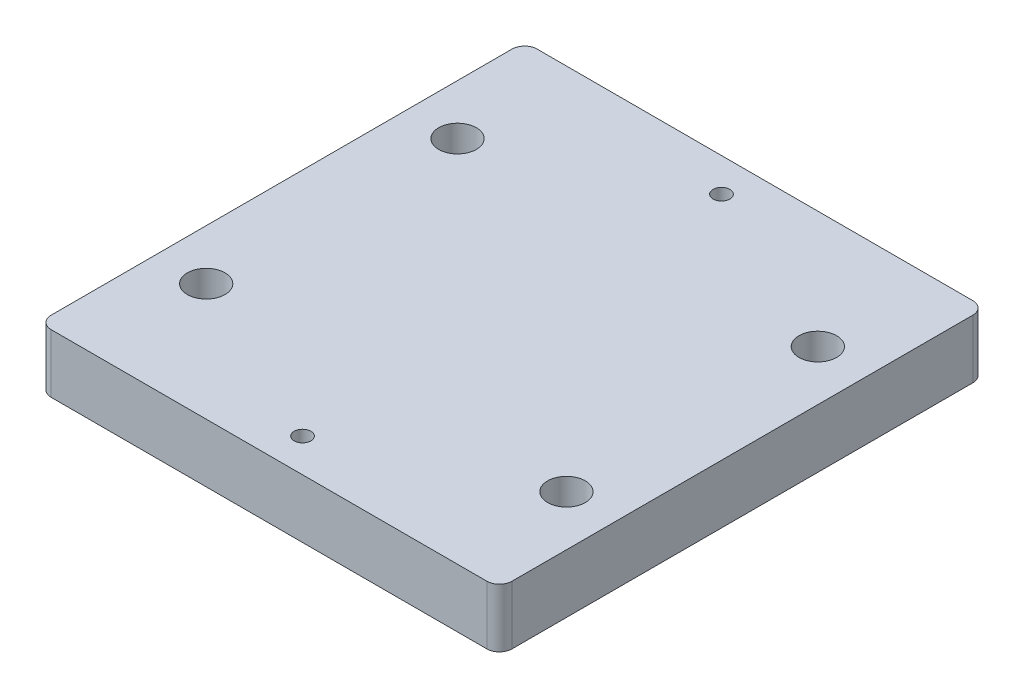
ISO-10303-21;
HEADER;
FILE_DESCRIPTION(('STEP AP214'),'2;1');
FILE_NAME('part.step','',(''),(''),'','','');
FILE_SCHEMA(('AUTOMOTIVE_DESIGN { 1 0 10303 214 1 1 1 1 }'));
ENDSEC;
DATA;
#1=APPLICATION_CONTEXT('core data for automotive mechanical design processes');
#2=APPLICATION_PROTOCOL_DEFINITION('international standard','automotive_design',2000,#1);
#3=PRODUCT_CONTEXT('',#1,'mechanical');
#4=PRODUCT('Part','Part','',(#3));
#5=PRODUCT_RELATED_PRODUCT_CATEGORY('part','',(#4));
#6=PRODUCT_DEFINITION_FORMATION('','',#4);
#7=PRODUCT_DEFINITION_CONTEXT('part definition',#1,'design');
#8=PRODUCT_DEFINITION('design','',#6,#7);
#9=PRODUCT_DEFINITION_SHAPE('','',#8);
#10=(LENGTH_UNIT() NAMED_UNIT(*) SI_UNIT(.MILLI.,.METRE.));
#11=(NAMED_UNIT(*) PLANE_ANGLE_UNIT() SI_UNIT($,.RADIAN.));
#12=(NAMED_UNIT(*) SI_UNIT($,.STERADIAN.) SOLID_ANGLE_UNIT());
#13=UNCERTAINTY_MEASURE_WITH_UNIT(LENGTH_MEASURE(1.E-05),#10,'distance_accuracy_value','');
#14=(GEOMETRIC_REPRESENTATION_CONTEXT(3) GLOBAL_UNCERTAINTY_ASSIGNED_CONTEXT((#13)) GLOBAL_UNIT_ASSIGNED_CONTEXT((#10,
#11,#12)) REPRESENTATION_CONTEXT('',''));
#15=CARTESIAN_POINT('',(0.,0.,0.));
#16=DIRECTION('',(0.,0.,1.));
#17=DIRECTION('',(1.,0.,0.));
#18=AXIS2_PLACEMENT_3D('',#15,#16,#17);
#19=CARTESIAN_POINT('',(0.,14.,0.));
#20=DIRECTION('',(0.,1.,0.));
#21=DIRECTION('',(0.,0.,1.));
#22=AXIS2_PLACEMENT_3D('',#19,#20,#21);
#23=PLANE('',#22);
#24=CARTESIAN_POINT('',(-42.9999999999994,14.,30.));
#25=DIRECTION('',(0.,1.,0.));
#26=DIRECTION('',(0.,0.,1.));
#27=AXIS2_PLACEMENT_3D('',#24,#25,#26);
#28=CIRCLE('',#27,4.5);
#29=CARTESIAN_POINT('',(-42.9999999999994,14.,34.5));
#30=VERTEX_POINT('',#29);
#31=EDGE_CURVE('E235',#30,#30,#28,.T.);
#32=ORIENTED_EDGE('',*,*,#31,.F.);
#33=EDGE_LOOP('',(#32));
#34=FACE_BOUND('',#33,.T.);
#35=CARTESIAN_POINT('',(43.,14.,-30.));
#36=DIRECTION('',(0.,1.,0.));
#37=DIRECTION('',(0.,0.,1.));
#38=AXIS2_PLACEMENT_3D('',#35,#36,#37);
#39=CIRCLE('',#38,4.5);
#40=CARTESIAN_POINT('',(43.,14.,-25.5));
#41=VERTEX_POINT('',#40);
#42=EDGE_CURVE('E219',#41,#41,#39,.T.);
#43=ORIENTED_EDGE('',*,*,#42,.F.);
#44=EDGE_LOOP('',(#43));
#45=FACE_BOUND('',#44,.T.);
#46=CARTESIAN_POINT('',(-43.,14.,-30.));
#47=DIRECTION('',(0.,1.,0.));
#48=DIRECTION('',(0.,0.,1.));
#49=AXIS2_PLACEMENT_3D('',#46,#47,#48);
#50=CIRCLE('',#49,4.5);
#51=CARTESIAN_POINT('',(-43.,14.,-25.5));
#52=VERTEX_POINT('',#51);
#53=EDGE_CURVE('E137',#52,#52,#50,.T.);
#54=ORIENTED_EDGE('',*,*,#53,.F.);
#55=EDGE_LOOP('',(#54));
#56=FACE_BOUND('',#55,.T.);
#57=DIRECTION('',(-1.,0.,0.));
#58=VECTOR('',#57,1.);
#59=CARTESIAN_POINT('',(-55.,14.,-58.));
#60=LINE('',#59,#58);
#61=CARTESIAN_POINT('',(52.,14.,-58.));
#62=VERTEX_POINT('',#61);
#63=CARTESIAN_POINT('',(-52.,14.,-58.));
#64=VERTEX_POINT('',#63);
#65=EDGE_CURVE('E148',#62,#64,#60,.T.);
#66=ORIENTED_EDGE('',*,*,#65,.T.);
#67=CARTESIAN_POINT('',(-52.,14.,-55.));
#68=DIRECTION('',(0.,1.,0.));
#69=DIRECTION('',(0.,0.,1.));
#70=AXIS2_PLACEMENT_3D('',#67,#68,#69);
#71=CIRCLE('',#70,3.);
#72=CARTESIAN_POINT('',(-55.,14.,-55.));
#73=VERTEX_POINT('',#72);
#74=EDGE_CURVE('E178',#64,#73,#71,.T.);
#75=ORIENTED_EDGE('',*,*,#74,.T.);
#76=DIRECTION('',(0.,0.,1.));
#77=VECTOR('',#76,1.);
#78=CARTESIAN_POINT('',(-55.,14.,-58.));
#79=LINE('',#78,#77);
#80=CARTESIAN_POINT('',(-55.,14.,55.));
#81=VERTEX_POINT('',#80);
#82=EDGE_CURVE('E127',#73,#81,#79,.T.);
#83=ORIENTED_EDGE('',*,*,#82,.T.);
#84=CARTESIAN_POINT('',(-52.,14.,55.));
#85=DIRECTION('',(0.,1.,0.));
#86=DIRECTION('',(0.,0.,1.));
#87=AXIS2_PLACEMENT_3D('',#84,#85,#86);
#88=CIRCLE('',#87,3.);
#89=CARTESIAN_POINT('',(-52.,14.,58.));
#90=VERTEX_POINT('',#89);
#91=EDGE_CURVE('E170',#81,#90,#88,.T.);
#92=ORIENTED_EDGE('',*,*,#91,.T.);
#93=DIRECTION('',(1.,0.,0.));
#94=VECTOR('',#93,1.);
#95=CARTESIAN_POINT('',(-55.,14.,58.));
#96=LINE('',#95,#94);
#97=CARTESIAN_POINT('',(52.,14.,58.));
#98=VERTEX_POINT('',#97);
#99=EDGE_CURVE('E193',#90,#98,#96,.T.);
#100=ORIENTED_EDGE('',*,*,#99,.T.);
#101=CARTESIAN_POINT('',(52.,14.,55.));
#102=DIRECTION('',(0.,1.,0.));
#103=DIRECTION('',(0.,0.,1.));
#104=AXIS2_PLACEMENT_3D('',#101,#102,#103);
#105=CIRCLE('',#104,3.);
#106=CARTESIAN_POINT('',(55.,14.,55.));
#107=VERTEX_POINT('',#106);
#108=EDGE_CURVE('E62',#98,#107,#105,.T.);
#109=ORIENTED_EDGE('',*,*,#108,.T.);
#110=DIRECTION('',(0.,0.,-1.));
#111=VECTOR('',#110,1.);
#112=CARTESIAN_POINT('',(55.,14.,-58.));
#113=LINE('',#112,#111);
#114=CARTESIAN_POINT('',(55.,14.,-55.));
#115=VERTEX_POINT('',#114);
#116=EDGE_CURVE('E201',#107,#115,#113,.T.);
#117=ORIENTED_EDGE('',*,*,#116,.T.);
#118=CARTESIAN_POINT('',(52.,14.,-55.));
#119=DIRECTION('',(0.,1.,0.));
#120=DIRECTION('',(0.,0.,1.));
#121=AXIS2_PLACEMENT_3D('',#118,#119,#120);
#122=CIRCLE('',#121,3.);
#123=EDGE_CURVE('E175',#115,#62,#122,.T.);
#124=ORIENTED_EDGE('',*,*,#123,.T.);
#125=EDGE_LOOP('',(#66,#75,#83,#92,#100,#109,#117,#124));
#126=FACE_BOUND('',#125,.T.);
#127=CARTESIAN_POINT('',(0.,14.,50.));
#128=DIRECTION('',(0.,1.,0.));
#129=DIRECTION('',(0.,0.,1.));
#130=AXIS2_PLACEMENT_3D('',#127,#128,#129);
#131=CIRCLE('',#130,2.);
#132=CARTESIAN_POINT('',(0.,14.,52.));
#133=VERTEX_POINT('',#132);
#134=EDGE_CURVE('E213',#133,#133,#131,.T.);
#135=ORIENTED_EDGE('',*,*,#134,.F.);
#136=EDGE_LOOP('',(#135));
#137=FACE_BOUND('',#136,.T.);
#138=CARTESIAN_POINT('',(43.0000000000006,14.,30.));
#139=DIRECTION('',(0.,1.,0.));
#140=DIRECTION('',(0.,0.,1.));
#141=AXIS2_PLACEMENT_3D('',#138,#139,#140);
#142=CIRCLE('',#141,4.5);
#143=CARTESIAN_POINT('',(43.0000000000006,14.,34.5));
#144=VERTEX_POINT('',#143);
#145=EDGE_CURVE('E227',#144,#144,#142,.T.);
#146=ORIENTED_EDGE('',*,*,#145,.F.);
#147=EDGE_LOOP('',(#146));
#148=FACE_BOUND('',#147,.T.);
#149=CARTESIAN_POINT('',(0.,14.,-50.));
#150=DIRECTION('',(0.,1.,0.));
#151=DIRECTION('',(0.,0.,-1.));
#152=AXIS2_PLACEMENT_3D('',#149,#150,#151);
#153=CIRCLE('',#152,2.);
#154=CARTESIAN_POINT('',(0.,14.,-52.));
#155=VERTEX_POINT('',#154);
#156=EDGE_CURVE('E243',#155,#155,#153,.T.);
#157=ORIENTED_EDGE('',*,*,#156,.F.);
#158=EDGE_LOOP('',(#157));
#159=FACE_BOUND('',#158,.T.);
#160=ADVANCED_FACE('F39',(#34,#45,#56,#126,#137,#148,#159),#23,.T.);
#161=CARTESIAN_POINT('',(0.,0.,0.));
#162=DIRECTION('',(0.,1.,0.));
#163=DIRECTION('',(0.,0.,1.));
#164=AXIS2_PLACEMENT_3D('',#161,#162,#163);
#165=PLANE('',#164);
#166=DIRECTION('',(0.,0.,1.));
#167=VECTOR('',#166,1.);
#168=CARTESIAN_POINT('',(-55.,0.,-58.));
#169=LINE('',#168,#167);
#170=CARTESIAN_POINT('',(-55.,0.,-55.));
#171=VERTEX_POINT('',#170);
#172=CARTESIAN_POINT('',(-55.,0.,55.));
#173=VERTEX_POINT('',#172);
#174=EDGE_CURVE('E124',#171,#173,#169,.T.);
#175=ORIENTED_EDGE('',*,*,#174,.F.);
#176=CARTESIAN_POINT('',(-52.,0.,-55.));
#177=DIRECTION('',(0.,1.,0.));
#178=DIRECTION('',(0.,0.,1.));
#179=AXIS2_PLACEMENT_3D('',#176,#177,#178);
#180=CIRCLE('',#179,3.);
#181=CARTESIAN_POINT('',(-52.,0.,-58.));
#182=VERTEX_POINT('',#181);
#183=EDGE_CURVE('E106',#171,#182,#180,.F.);
#184=ORIENTED_EDGE('',*,*,#183,.T.);
#185=DIRECTION('',(-1.,0.,0.));
#186=VECTOR('',#185,1.);
#187=CARTESIAN_POINT('',(-55.,0.,-58.));
#188=LINE('',#187,#186);
#189=CARTESIAN_POINT('',(52.,0.,-58.));
#190=VERTEX_POINT('',#189);
#191=EDGE_CURVE('E153',#190,#182,#188,.T.);
#192=ORIENTED_EDGE('',*,*,#191,.F.);
#193=CARTESIAN_POINT('',(52.,0.,-55.));
#194=DIRECTION('',(0.,1.,0.));
#195=DIRECTION('',(0.,0.,1.));
#196=AXIS2_PLACEMENT_3D('',#193,#194,#195);
#197=CIRCLE('',#196,3.);
#198=CARTESIAN_POINT('',(55.,0.,-55.));
#199=VERTEX_POINT('',#198);
#200=EDGE_CURVE('E118',#190,#199,#197,.F.);
#201=ORIENTED_EDGE('',*,*,#200,.T.);
#202=DIRECTION('',(0.,0.,-1.));
#203=VECTOR('',#202,1.);
#204=CARTESIAN_POINT('',(55.,0.,-58.));
#205=LINE('',#204,#203);
#206=CARTESIAN_POINT('',(55.,0.,55.));
#207=VERTEX_POINT('',#206);
#208=EDGE_CURVE('E142',#207,#199,#205,.T.);
#209=ORIENTED_EDGE('',*,*,#208,.F.);
#210=CARTESIAN_POINT('',(52.,0.,55.));
#211=DIRECTION('',(0.,1.,0.));
#212=DIRECTION('',(0.,0.,1.));
#213=AXIS2_PLACEMENT_3D('',#210,#211,#212);
#214=CIRCLE('',#213,3.);
#215=CARTESIAN_POINT('',(52.,0.,58.));
#216=VERTEX_POINT('',#215);
#217=EDGE_CURVE('E160',#207,#216,#214,.F.);
#218=ORIENTED_EDGE('',*,*,#217,.T.);
#219=DIRECTION('',(1.,0.,0.));
#220=VECTOR('',#219,1.);
#221=CARTESIAN_POINT('',(-55.,0.,58.));
#222=LINE('',#221,#220);
#223=CARTESIAN_POINT('',(-52.,0.,58.));
#224=VERTEX_POINT('',#223);
#225=EDGE_CURVE('E136',#224,#216,#222,.T.);
#226=ORIENTED_EDGE('',*,*,#225,.F.);
#227=CARTESIAN_POINT('',(-52.,0.,55.));
#228=DIRECTION('',(0.,1.,0.));
#229=DIRECTION('',(0.,0.,1.));
#230=AXIS2_PLACEMENT_3D('',#227,#228,#229);
#231=CIRCLE('',#230,3.);
#232=EDGE_CURVE('E129',#224,#173,#231,.F.);
#233=ORIENTED_EDGE('',*,*,#232,.T.);
#234=EDGE_LOOP('',(#175,#184,#192,#201,#209,#218,#226,#233));
#235=FACE_BOUND('',#234,.T.);
#236=CARTESIAN_POINT('',(-43.,0.,-30.));
#237=DIRECTION('',(0.,1.,0.));
#238=DIRECTION('',(0.,0.,1.));
#239=AXIS2_PLACEMENT_3D('',#236,#237,#238);
#240=CIRCLE('',#239,4.5);
#241=CARTESIAN_POINT('',(-43.,0.,-25.5));
#242=VERTEX_POINT('',#241);
#243=EDGE_CURVE('E145',#242,#242,#240,.T.);
#244=ORIENTED_EDGE('',*,*,#243,.T.);
#245=EDGE_LOOP('',(#244));
#246=FACE_BOUND('',#245,.T.);
#247=CARTESIAN_POINT('',(0.,0.,50.));
#248=DIRECTION('',(0.,1.,0.));
#249=DIRECTION('',(0.,0.,1.));
#250=AXIS2_PLACEMENT_3D('',#247,#248,#249);
#251=CIRCLE('',#250,2.);
#252=CARTESIAN_POINT('',(0.,0.,52.));
#253=VERTEX_POINT('',#252);
#254=EDGE_CURVE('E215',#253,#253,#251,.T.);
#255=ORIENTED_EDGE('',*,*,#254,.T.);
#256=EDGE_LOOP('',(#255));
#257=FACE_BOUND('',#256,.T.);
#258=CARTESIAN_POINT('',(43.,0.,-30.));
#259=DIRECTION('',(0.,1.,0.));
#260=DIRECTION('',(0.,0.,1.));
#261=AXIS2_PLACEMENT_3D('',#258,#259,#260);
#262=CIRCLE('',#261,4.5);
#263=CARTESIAN_POINT('',(43.,0.,-25.5));
#264=VERTEX_POINT('',#263);
#265=EDGE_CURVE('E223',#264,#264,#262,.T.);
#266=ORIENTED_EDGE('',*,*,#265,.T.);
#267=EDGE_LOOP('',(#266));
#268=FACE_BOUND('',#267,.T.);
#269=CARTESIAN_POINT('',(43.0000000000006,0.,30.));
#270=DIRECTION('',(0.,1.,0.));
#271=DIRECTION('',(0.,0.,1.));
#272=AXIS2_PLACEMENT_3D('',#269,#270,#271);
#273=CIRCLE('',#272,4.5);
#274=CARTESIAN_POINT('',(43.0000000000006,0.,34.5));
#275=VERTEX_POINT('',#274);
#276=EDGE_CURVE('E231',#275,#275,#273,.T.);
#277=ORIENTED_EDGE('',*,*,#276,.T.);
#278=EDGE_LOOP('',(#277));
#279=FACE_BOUND('',#278,.T.);
#280=CARTESIAN_POINT('',(-42.9999999999994,0.,30.));
#281=DIRECTION('',(0.,1.,0.));
#282=DIRECTION('',(0.,0.,1.));
#283=AXIS2_PLACEMENT_3D('',#280,#281,#282);
#284=CIRCLE('',#283,4.5);
#285=CARTESIAN_POINT('',(-42.9999999999994,0.,34.5));
#286=VERTEX_POINT('',#285);
#287=EDGE_CURVE('E239',#286,#286,#284,.T.);
#288=ORIENTED_EDGE('',*,*,#287,.T.);
#289=EDGE_LOOP('',(#288));
#290=FACE_BOUND('',#289,.T.);
#291=CARTESIAN_POINT('',(0.,0.,-50.));
#292=DIRECTION('',(0.,1.,0.));
#293=DIRECTION('',(0.,0.,-1.));
#294=AXIS2_PLACEMENT_3D('',#291,#292,#293);
#295=CIRCLE('',#294,2.);
#296=CARTESIAN_POINT('',(0.,0.,-52.));
#297=VERTEX_POINT('',#296);
#298=EDGE_CURVE('E247',#297,#297,#295,.T.);
#299=ORIENTED_EDGE('',*,*,#298,.T.);
#300=EDGE_LOOP('',(#299));
#301=FACE_BOUND('',#300,.T.);
#302=ADVANCED_FACE('F132',(#235,#246,#257,#268,#279,#290,#301),#165,.F.);
#303=CARTESIAN_POINT('',(-55.,14.,-58.));
#304=DIRECTION('',(1.,0.,0.));
#305=DIRECTION('',(0.,0.,-1.));
#306=AXIS2_PLACEMENT_3D('',#303,#304,#305);
#307=PLANE('',#306);
#308=ORIENTED_EDGE('',*,*,#82,.F.);
#309=DIRECTION('',(0.,-1.,0.));
#310=VECTOR('',#309,1.);
#311=CARTESIAN_POINT('',(-55.,14.,-55.));
#312=LINE('',#311,#310);
#313=EDGE_CURVE('E110',#73,#171,#312,.T.);
#314=ORIENTED_EDGE('',*,*,#313,.T.);
#315=ORIENTED_EDGE('',*,*,#174,.T.);
#316=DIRECTION('',(0.,-1.,0.));
#317=VECTOR('',#316,1.);
#318=CARTESIAN_POINT('',(-55.,14.,55.));
#319=LINE('',#318,#317);
#320=EDGE_CURVE('E130',#173,#81,#319,.F.);
#321=ORIENTED_EDGE('',*,*,#320,.T.);
#322=EDGE_LOOP('',(#308,#314,#315,#321));
#323=FACE_BOUND('',#322,.T.);
#324=ADVANCED_FACE('F123',(#323),#307,.F.);
#325=CARTESIAN_POINT('',(-55.,14.,58.));
#326=DIRECTION('',(0.,0.,-1.));
#327=DIRECTION('',(-1.,0.,0.));
#328=AXIS2_PLACEMENT_3D('',#325,#326,#327);
#329=PLANE('',#328);
#330=ORIENTED_EDGE('',*,*,#225,.T.);
#331=DIRECTION('',(0.,-1.,0.));
#332=VECTOR('',#331,1.);
#333=CARTESIAN_POINT('',(52.,14.,58.));
#334=LINE('',#333,#332);
#335=EDGE_CURVE('E11',#216,#98,#334,.F.);
#336=ORIENTED_EDGE('',*,*,#335,.T.);
#337=ORIENTED_EDGE('',*,*,#99,.F.);
#338=DIRECTION('',(0.,-1.,0.));
#339=VECTOR('',#338,1.);
#340=CARTESIAN_POINT('',(-52.,14.,58.));
#341=LINE('',#340,#339);
#342=EDGE_CURVE('E48',#90,#224,#341,.T.);
#343=ORIENTED_EDGE('',*,*,#342,.T.);
#344=EDGE_LOOP('',(#330,#336,#337,#343));
#345=FACE_BOUND('',#344,.T.);
#346=ADVANCED_FACE('F191',(#345),#329,.F.);
#347=CARTESIAN_POINT('',(55.,14.,-58.));
#348=DIRECTION('',(-1.,0.,0.));
#349=DIRECTION('',(0.,0.,1.));
#350=AXIS2_PLACEMENT_3D('',#347,#348,#349);
#351=PLANE('',#350);
#352=ORIENTED_EDGE('',*,*,#208,.T.);
#353=DIRECTION('',(0.,-1.,0.));
#354=VECTOR('',#353,1.);
#355=CARTESIAN_POINT('',(55.,14.,-55.));
#356=LINE('',#355,#354);
#357=EDGE_CURVE('E55',#199,#115,#356,.F.);
#358=ORIENTED_EDGE('',*,*,#357,.T.);
#359=ORIENTED_EDGE('',*,*,#116,.F.);
#360=DIRECTION('',(0.,-1.,0.));
#361=VECTOR('',#360,1.);
#362=CARTESIAN_POINT('',(55.,14.,55.));
#363=LINE('',#362,#361);
#364=EDGE_CURVE('E181',#107,#207,#363,.T.);
#365=ORIENTED_EDGE('',*,*,#364,.T.);
#366=EDGE_LOOP('',(#352,#358,#359,#365));
#367=FACE_BOUND('',#366,.T.);
#368=ADVANCED_FACE('F200',(#367),#351,.F.);
#369=CARTESIAN_POINT('',(-55.,14.,-58.));
#370=DIRECTION('',(0.,0.,1.));
#371=DIRECTION('',(1.,0.,0.));
#372=AXIS2_PLACEMENT_3D('',#369,#370,#371);
#373=PLANE('',#372);
#374=ORIENTED_EDGE('',*,*,#191,.T.);
#375=DIRECTION('',(0.,-1.,0.));
#376=VECTOR('',#375,1.);
#377=CARTESIAN_POINT('',(-52.,14.,-58.));
#378=LINE('',#377,#376);
#379=EDGE_CURVE('E111',#182,#64,#378,.F.);
#380=ORIENTED_EDGE('',*,*,#379,.T.);
#381=ORIENTED_EDGE('',*,*,#65,.F.);
#382=DIRECTION('',(0.,-1.,0.));
#383=VECTOR('',#382,1.);
#384=CARTESIAN_POINT('',(52.,14.,-58.));
#385=LINE('',#384,#383);
#386=EDGE_CURVE('E117',#62,#190,#385,.T.);
#387=ORIENTED_EDGE('',*,*,#386,.T.);
#388=EDGE_LOOP('',(#374,#380,#381,#387));
#389=FACE_BOUND('',#388,.T.);
#390=ADVANCED_FACE('F271',(#389),#373,.F.);
#391=CARTESIAN_POINT('',(-43.,14.,-30.));
#392=DIRECTION('',(0.,-1.,0.));
#393=DIRECTION('',(0.,0.,-1.));
#394=AXIS2_PLACEMENT_3D('',#391,#392,#393);
#395=CYLINDRICAL_SURFACE('',#394,4.5);
#396=ORIENTED_EDGE('',*,*,#53,.T.);
#397=EDGE_LOOP('',(#396));
#398=FACE_BOUND('',#397,.T.);
#399=ORIENTED_EDGE('',*,*,#243,.F.);
#400=EDGE_LOOP('',(#399));
#401=FACE_BOUND('',#400,.T.);
#402=ADVANCED_FACE('F268',(#398,#401),#395,.F.);
#403=CARTESIAN_POINT('',(0.,14.,50.));
#404=DIRECTION('',(0.,-1.,0.));
#405=DIRECTION('',(0.,0.,-1.));
#406=AXIS2_PLACEMENT_3D('',#403,#404,#405);
#407=CYLINDRICAL_SURFACE('',#406,2.);
#408=ORIENTED_EDGE('',*,*,#134,.T.);
#409=EDGE_LOOP('',(#408));
#410=FACE_BOUND('',#409,.T.);
#411=ORIENTED_EDGE('',*,*,#254,.F.);
#412=EDGE_LOOP('',(#411));
#413=FACE_BOUND('',#412,.T.);
#414=ADVANCED_FACE('F320',(#410,#413),#407,.F.);
#415=CARTESIAN_POINT('',(43.,14.,-30.));
#416=DIRECTION('',(0.,-1.,0.));
#417=DIRECTION('',(0.,0.,-1.));
#418=AXIS2_PLACEMENT_3D('',#415,#416,#417);
#419=CYLINDRICAL_SURFACE('',#418,4.5);
#420=ORIENTED_EDGE('',*,*,#42,.T.);
#421=EDGE_LOOP('',(#420));
#422=FACE_BOUND('',#421,.T.);
#423=ORIENTED_EDGE('',*,*,#265,.F.);
#424=EDGE_LOOP('',(#423));
#425=FACE_BOUND('',#424,.T.);
#426=ADVANCED_FACE('F303',(#422,#425),#419,.F.);
#427=CARTESIAN_POINT('',(43.0000000000006,14.,30.));
#428=DIRECTION('',(0.,-1.,0.));
#429=DIRECTION('',(0.,0.,-1.));
#430=AXIS2_PLACEMENT_3D('',#427,#428,#429);
#431=CYLINDRICAL_SURFACE('',#430,4.5);
#432=ORIENTED_EDGE('',*,*,#145,.T.);
#433=EDGE_LOOP('',(#432));
#434=FACE_BOUND('',#433,.T.);
#435=ORIENTED_EDGE('',*,*,#276,.F.);
#436=EDGE_LOOP('',(#435));
#437=FACE_BOUND('',#436,.T.);
#438=ADVANCED_FACE('F299',(#434,#437),#431,.F.);
#439=CARTESIAN_POINT('',(-42.9999999999994,14.,30.));
#440=DIRECTION('',(0.,-1.,0.));
#441=DIRECTION('',(0.,0.,-1.));
#442=AXIS2_PLACEMENT_3D('',#439,#440,#441);
#443=CYLINDRICAL_SURFACE('',#442,4.5);
#444=ORIENTED_EDGE('',*,*,#31,.T.);
#445=EDGE_LOOP('',(#444));
#446=FACE_BOUND('',#445,.T.);
#447=ORIENTED_EDGE('',*,*,#287,.F.);
#448=EDGE_LOOP('',(#447));
#449=FACE_BOUND('',#448,.T.);
#450=ADVANCED_FACE('F302',(#446,#449),#443,.F.);
#451=CARTESIAN_POINT('',(0.,14.,-50.));
#452=DIRECTION('',(0.,-1.,0.));
#453=DIRECTION('',(0.,0.,-1.));
#454=AXIS2_PLACEMENT_3D('',#451,#452,#453);
#455=CYLINDRICAL_SURFACE('',#454,2.);
#456=ORIENTED_EDGE('',*,*,#156,.T.);
#457=EDGE_LOOP('',(#456));
#458=FACE_BOUND('',#457,.T.);
#459=ORIENTED_EDGE('',*,*,#298,.F.);
#460=EDGE_LOOP('',(#459));
#461=FACE_BOUND('',#460,.T.);
#462=ADVANCED_FACE('F255',(#458,#461),#455,.F.);
#463=CARTESIAN_POINT('',(-52.,14.,-55.));
#464=DIRECTION('',(0.,-1.,0.));
#465=DIRECTION('',(0.,0.,-1.));
#466=AXIS2_PLACEMENT_3D('',#463,#464,#465);
#467=CYLINDRICAL_SURFACE('',#466,3.);
#468=ORIENTED_EDGE('',*,*,#74,.F.);
#469=ORIENTED_EDGE('',*,*,#379,.F.);
#470=ORIENTED_EDGE('',*,*,#183,.F.);
#471=ORIENTED_EDGE('',*,*,#313,.F.);
#472=EDGE_LOOP('',(#468,#469,#470,#471));
#473=FACE_BOUND('',#472,.T.);
#474=ADVANCED_FACE('F109',(#473),#467,.T.);
#475=CARTESIAN_POINT('',(52.,14.,-55.));
#476=DIRECTION('',(0.,-1.,0.));
#477=DIRECTION('',(0.,0.,-1.));
#478=AXIS2_PLACEMENT_3D('',#475,#476,#477);
#479=CYLINDRICAL_SURFACE('',#478,3.);
#480=ORIENTED_EDGE('',*,*,#123,.F.);
#481=ORIENTED_EDGE('',*,*,#357,.F.);
#482=ORIENTED_EDGE('',*,*,#200,.F.);
#483=ORIENTED_EDGE('',*,*,#386,.F.);
#484=EDGE_LOOP('',(#480,#481,#482,#483));
#485=FACE_BOUND('',#484,.T.);
#486=ADVANCED_FACE('F283',(#485),#479,.T.);
#487=CARTESIAN_POINT('',(52.,14.,55.));
#488=DIRECTION('',(0.,-1.,0.));
#489=DIRECTION('',(0.,0.,-1.));
#490=AXIS2_PLACEMENT_3D('',#487,#488,#489);
#491=CYLINDRICAL_SURFACE('',#490,3.);
#492=ORIENTED_EDGE('',*,*,#108,.F.);
#493=ORIENTED_EDGE('',*,*,#335,.F.);
#494=ORIENTED_EDGE('',*,*,#217,.F.);
#495=ORIENTED_EDGE('',*,*,#364,.F.);
#496=EDGE_LOOP('',(#492,#493,#494,#495));
#497=FACE_BOUND('',#496,.T.);
#498=ADVANCED_FACE('F199',(#497),#491,.T.);
#499=CARTESIAN_POINT('',(-52.,14.,55.));
#500=DIRECTION('',(0.,-1.,0.));
#501=DIRECTION('',(0.,0.,-1.));
#502=AXIS2_PLACEMENT_3D('',#499,#500,#501);
#503=CYLINDRICAL_SURFACE('',#502,3.);
#504=ORIENTED_EDGE('',*,*,#91,.F.);
#505=ORIENTED_EDGE('',*,*,#320,.F.);
#506=ORIENTED_EDGE('',*,*,#232,.F.);
#507=ORIENTED_EDGE('',*,*,#342,.F.);
#508=EDGE_LOOP('',(#504,#505,#506,#507));
#509=FACE_BOUND('',#508,.T.);
#510=ADVANCED_FACE('F41',(#509),#503,.T.);
#511=CLOSED_SHELL('',(#160,#302,#324,#346,#368,#390,#402,#414,#426,#438,#450,#462,#474,#486,
#498,#510));
#512=MANIFOLD_SOLID_BREP('B2',#511);
#513=ADVANCED_BREP_SHAPE_REPRESENTATION('',(#18,#512),#14);
#514=SHAPE_DEFINITION_REPRESENTATION(#9,#513);
ENDSEC;
END-ISO-10303-21;
